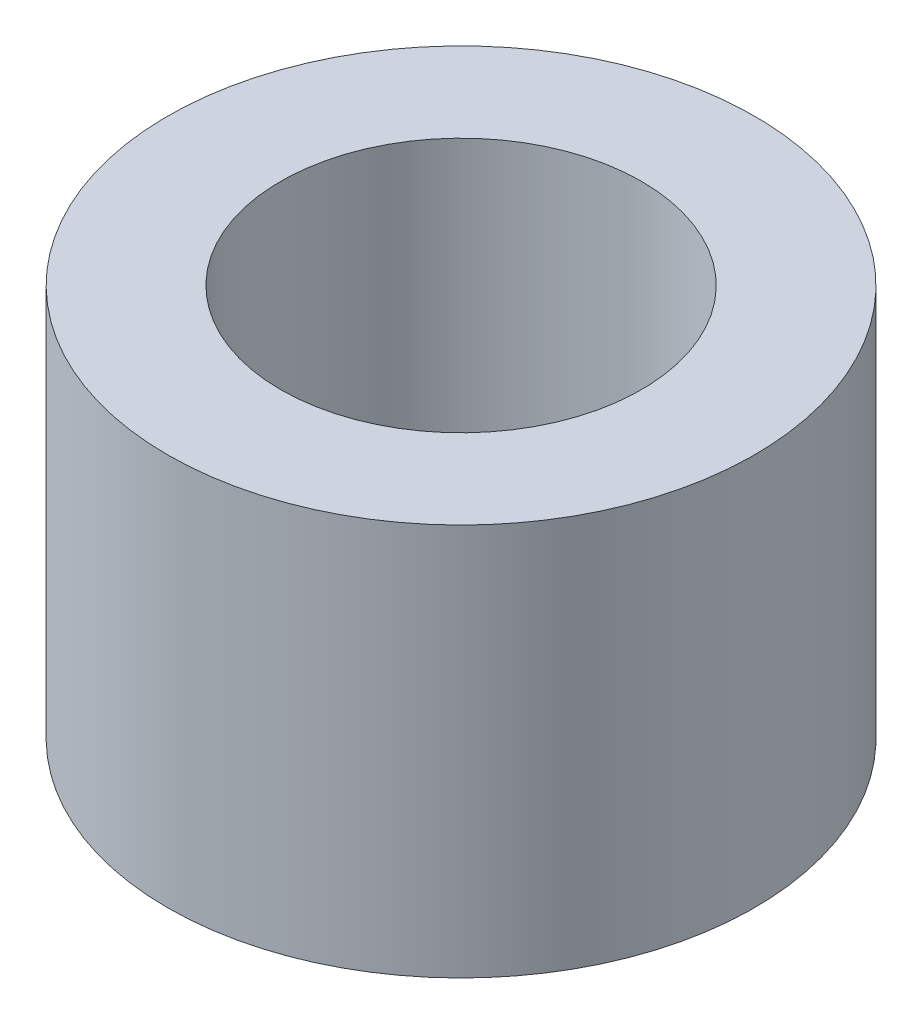
ISO-10303-21;
HEADER;
FILE_DESCRIPTION(('STEP AP214'),'2;1');
FILE_NAME('part.step','',(''),(''),'','','');
FILE_SCHEMA(('AUTOMOTIVE_DESIGN { 1 0 10303 214 1 1 1 1 }'));
ENDSEC;
DATA;
#1=APPLICATION_CONTEXT('core data for automotive mechanical design processes');
#2=APPLICATION_PROTOCOL_DEFINITION('international standard','automotive_design',2000,#1);
#3=PRODUCT_CONTEXT('',#1,'mechanical');
#4=PRODUCT('Part','Part','',(#3));
#5=PRODUCT_RELATED_PRODUCT_CATEGORY('part','',(#4));
#6=PRODUCT_DEFINITION_FORMATION('','',#4);
#7=PRODUCT_DEFINITION_CONTEXT('part definition',#1,'design');
#8=PRODUCT_DEFINITION('design','',#6,#7);
#9=PRODUCT_DEFINITION_SHAPE('','',#8);
#10=(LENGTH_UNIT() NAMED_UNIT(*) SI_UNIT(.MILLI.,.METRE.));
#11=(NAMED_UNIT(*) PLANE_ANGLE_UNIT() SI_UNIT($,.RADIAN.));
#12=(NAMED_UNIT(*) SI_UNIT($,.STERADIAN.) SOLID_ANGLE_UNIT());
#13=UNCERTAINTY_MEASURE_WITH_UNIT(LENGTH_MEASURE(1.E-05),#10,'distance_accuracy_value','');
#14=(GEOMETRIC_REPRESENTATION_CONTEXT(3) GLOBAL_UNCERTAINTY_ASSIGNED_CONTEXT((#13)) GLOBAL_UNIT_ASSIGNED_CONTEXT((#10,
#11,#12)) REPRESENTATION_CONTEXT('',''));
#15=CARTESIAN_POINT('',(0.,0.,0.));
#16=DIRECTION('',(0.,0.,1.));
#17=DIRECTION('',(1.,0.,0.));
#18=AXIS2_PLACEMENT_3D('',#15,#16,#17);
#19=CARTESIAN_POINT('',(0.,3.175,0.));
#20=DIRECTION('',(0.,1.,0.));
#21=DIRECTION('',(0.,0.,1.));
#22=AXIS2_PLACEMENT_3D('',#19,#20,#21);
#23=PLANE('',#22);
#24=CARTESIAN_POINT('',(0.,3.175,0.));
#25=DIRECTION('',(0.,1.,0.));
#26=DIRECTION('',(0.,0.,1.));
#27=AXIS2_PLACEMENT_3D('',#24,#25,#26);
#28=CIRCLE('',#27,2.3749);
#29=CARTESIAN_POINT('',(0.,3.175,2.3749));
#30=VERTEX_POINT('',#29);
#31=EDGE_CURVE('E10',#30,#30,#28,.T.);
#32=ORIENTED_EDGE('',*,*,#31,.T.);
#33=EDGE_LOOP('',(#32));
#34=FACE_BOUND('',#33,.T.);
#35=CARTESIAN_POINT('',(0.,3.175,0.));
#36=DIRECTION('',(0.,1.,0.));
#37=DIRECTION('',(0.,0.,1.));
#38=AXIS2_PLACEMENT_3D('',#35,#36,#37);
#39=CIRCLE('',#38,1.4605);
#40=CARTESIAN_POINT('',(0.,3.175,1.4605));
#41=VERTEX_POINT('',#40);
#42=EDGE_CURVE('E42',#41,#41,#39,.T.);
#43=ORIENTED_EDGE('',*,*,#42,.F.);
#44=EDGE_LOOP('',(#43));
#45=FACE_BOUND('',#44,.T.);
#46=ADVANCED_FACE('F31',(#34,#45),#23,.T.);
#47=CARTESIAN_POINT('',(0.,0.,0.));
#48=DIRECTION('',(0.,1.,0.));
#49=DIRECTION('',(0.,0.,1.));
#50=AXIS2_PLACEMENT_3D('',#47,#48,#49);
#51=PLANE('',#50);
#52=CARTESIAN_POINT('',(0.,0.,0.));
#53=DIRECTION('',(0.,1.,0.));
#54=DIRECTION('',(0.,0.,1.));
#55=AXIS2_PLACEMENT_3D('',#52,#53,#54);
#56=CIRCLE('',#55,2.3749);
#57=CARTESIAN_POINT('',(0.,0.,2.3749));
#58=VERTEX_POINT('',#57);
#59=EDGE_CURVE('E35',#58,#58,#56,.T.);
#60=ORIENTED_EDGE('',*,*,#59,.F.);
#61=EDGE_LOOP('',(#60));
#62=FACE_BOUND('',#61,.T.);
#63=CARTESIAN_POINT('',(0.,0.,0.));
#64=DIRECTION('',(0.,1.,0.));
#65=DIRECTION('',(0.,0.,1.));
#66=AXIS2_PLACEMENT_3D('',#63,#64,#65);
#67=CIRCLE('',#66,1.4605);
#68=CARTESIAN_POINT('',(0.,0.,1.4605));
#69=VERTEX_POINT('',#68);
#70=EDGE_CURVE('E44',#69,#69,#67,.T.);
#71=ORIENTED_EDGE('',*,*,#70,.T.);
#72=EDGE_LOOP('',(#71));
#73=FACE_BOUND('',#72,.T.);
#74=ADVANCED_FACE('F54',(#62,#73),#51,.F.);
#75=CARTESIAN_POINT('',(0.,3.175,0.));
#76=DIRECTION('',(0.,-1.,0.));
#77=DIRECTION('',(0.,0.,-1.));
#78=AXIS2_PLACEMENT_3D('',#75,#76,#77);
#79=CYLINDRICAL_SURFACE('',#78,2.3749);
#80=ORIENTED_EDGE('',*,*,#31,.F.);
#81=EDGE_LOOP('',(#80));
#82=FACE_BOUND('',#81,.T.);
#83=ORIENTED_EDGE('',*,*,#59,.T.);
#84=EDGE_LOOP('',(#83));
#85=FACE_BOUND('',#84,.T.);
#86=ADVANCED_FACE('F33',(#82,#85),#79,.T.);
#87=CARTESIAN_POINT('',(0.,3.175,0.));
#88=DIRECTION('',(0.,-1.,0.));
#89=DIRECTION('',(0.,0.,-1.));
#90=AXIS2_PLACEMENT_3D('',#87,#88,#89);
#91=CYLINDRICAL_SURFACE('',#90,1.4605);
#92=ORIENTED_EDGE('',*,*,#42,.T.);
#93=EDGE_LOOP('',(#92));
#94=FACE_BOUND('',#93,.T.);
#95=ORIENTED_EDGE('',*,*,#70,.F.);
#96=EDGE_LOOP('',(#95));
#97=FACE_BOUND('',#96,.T.);
#98=ADVANCED_FACE('F50',(#94,#97),#91,.F.);
#99=CLOSED_SHELL('',(#46,#74,#86,#98));
#100=MANIFOLD_SOLID_BREP('B2',#99);
#101=ADVANCED_BREP_SHAPE_REPRESENTATION('',(#18,#100),#14);
#102=SHAPE_DEFINITION_REPRESENTATION(#9,#101);
ENDSEC;
END-ISO-10303-21;
